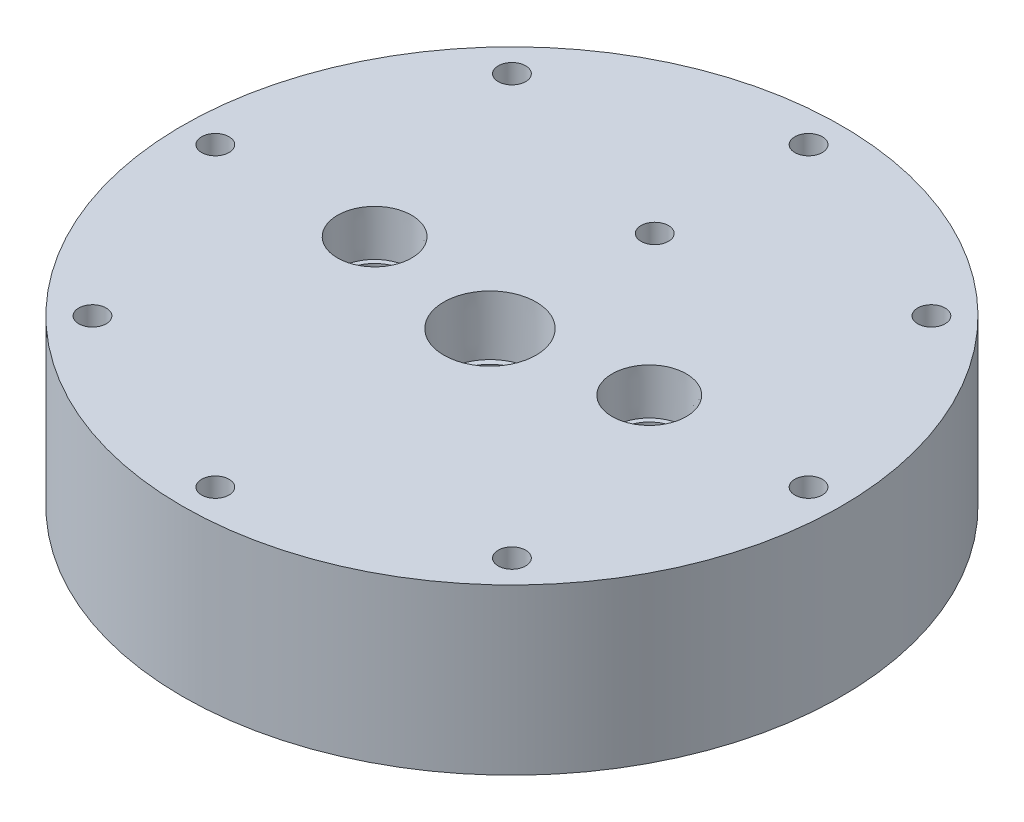
ISO-10303-21;
HEADER;
FILE_DESCRIPTION(('STEP AP214'),'2;1');
FILE_NAME('part.step','',(''),(''),'','','');
FILE_SCHEMA(('AUTOMOTIVE_DESIGN { 1 0 10303 214 1 1 1 1 }'));
ENDSEC;
DATA;
#1=APPLICATION_CONTEXT('core data for automotive mechanical design processes');
#2=APPLICATION_PROTOCOL_DEFINITION('international standard','automotive_design',2000,#1);
#3=PRODUCT_CONTEXT('',#1,'mechanical');
#4=PRODUCT('Part','Part','',(#3));
#5=PRODUCT_RELATED_PRODUCT_CATEGORY('part','',(#4));
#6=PRODUCT_DEFINITION_FORMATION('','',#4);
#7=PRODUCT_DEFINITION_CONTEXT('part definition',#1,'design');
#8=PRODUCT_DEFINITION('design','',#6,#7);
#9=PRODUCT_DEFINITION_SHAPE('','',#8);
#10=(LENGTH_UNIT() NAMED_UNIT(*) SI_UNIT(.MILLI.,.METRE.));
#11=(NAMED_UNIT(*) PLANE_ANGLE_UNIT() SI_UNIT($,.RADIAN.));
#12=(NAMED_UNIT(*) SI_UNIT($,.STERADIAN.) SOLID_ANGLE_UNIT());
#13=UNCERTAINTY_MEASURE_WITH_UNIT(LENGTH_MEASURE(1.E-05),#10,'distance_accuracy_value','');
#14=(GEOMETRIC_REPRESENTATION_CONTEXT(3) GLOBAL_UNCERTAINTY_ASSIGNED_CONTEXT((#13)) GLOBAL_UNIT_ASSIGNED_CONTEXT((#10,
#11,#12)) REPRESENTATION_CONTEXT('',''));
#15=CARTESIAN_POINT('',(0.,0.,0.));
#16=DIRECTION('',(0.,0.,1.));
#17=DIRECTION('',(1.,0.,0.));
#18=AXIS2_PLACEMENT_3D('',#15,#16,#17);
#19=CARTESIAN_POINT('',(0.,-36.83,0.));
#20=DIRECTION('',(0.,1.,0.));
#21=DIRECTION('',(0.,0.,1.));
#22=AXIS2_PLACEMENT_3D('',#19,#20,#21);
#23=PLANE('',#22);
#24=CARTESIAN_POINT('',(0.,-36.83,0.));
#25=DIRECTION('',(0.,1.,0.));
#26=DIRECTION('',(0.,0.,1.));
#27=AXIS2_PLACEMENT_3D('',#24,#25,#26);
#28=CIRCLE('',#27,13.97);
#29=CARTESIAN_POINT('',(-1.36470758739021,-36.83,13.903182125));
#30=VERTEX_POINT('',#29);
#31=CARTESIAN_POINT('',(1.36470758739021,-36.83,13.903182125));
#32=VERTEX_POINT('',#31);
#33=EDGE_CURVE('E71',#30,#32,#28,.F.);
#34=ORIENTED_EDGE('',*,*,#33,.F.);
#35=CARTESIAN_POINT('',(0.,-36.83,5.08));
#36=DIRECTION('',(0.,1.,0.));
#37=DIRECTION('',(0.,0.,1.));
#38=AXIS2_PLACEMENT_3D('',#35,#36,#37);
#39=CIRCLE('',#38,8.9281);
#40=EDGE_CURVE('E56',#30,#32,#39,.T.);
#41=ORIENTED_EDGE('',*,*,#40,.T.);
#42=EDGE_LOOP('',(#34,#41));
#43=FACE_BOUND('',#42,.T.);
#44=CARTESIAN_POINT('',(0.,-36.83,0.));
#45=DIRECTION('',(0.,-1.,0.));
#46=DIRECTION('',(0.,0.,-1.));
#47=AXIS2_PLACEMENT_3D('',#44,#45,#46);
#48=CIRCLE('',#47,16.51);
#49=CARTESIAN_POINT('',(0.,-36.83,-16.51));
#50=VERTEX_POINT('',#49);
#51=EDGE_CURVE('E217',#50,#50,#48,.T.);
#52=ORIENTED_EDGE('',*,*,#51,.T.);
#53=EDGE_LOOP('',(#52));
#54=FACE_BOUND('',#53,.T.);
#55=ADVANCED_FACE('F35',(#43,#54),#23,.F.);
#56=CARTESIAN_POINT('',(0.,-40.64,0.));
#57=DIRECTION('',(0.,1.,0.));
#58=DIRECTION('',(0.,0.,1.));
#59=AXIS2_PLACEMENT_3D('',#56,#57,#58);
#60=PLANE('',#59);
#61=CARTESIAN_POINT('',(0.,-40.64,-33.02));
#62=DIRECTION('',(0.,1.,0.));
#63=DIRECTION('',(0.,0.,1.));
#64=AXIS2_PLACEMENT_3D('',#61,#62,#63);
#65=CIRCLE('',#64,3.175);
#66=CARTESIAN_POINT('',(0.,-40.64,-29.845));
#67=VERTEX_POINT('',#66);
#68=EDGE_CURVE('E235',#67,#67,#65,.F.);
#69=ORIENTED_EDGE('',*,*,#68,.F.);
#70=EDGE_LOOP('',(#69));
#71=FACE_BOUND('',#70,.T.);
#72=CARTESIAN_POINT('',(0.,-40.64,-33.02));
#73=DIRECTION('',(0.,1.,0.));
#74=DIRECTION('',(0.,0.,1.));
#75=AXIS2_PLACEMENT_3D('',#72,#73,#74);
#76=CIRCLE('',#75,7.62);
#77=CARTESIAN_POINT('',(0.,-40.64,-25.4));
#78=VERTEX_POINT('',#77);
#79=EDGE_CURVE('E214',#78,#78,#76,.T.);
#80=ORIENTED_EDGE('',*,*,#79,.F.);
#81=EDGE_LOOP('',(#80));
#82=FACE_BOUND('',#81,.T.);
#83=ADVANCED_FACE('F184',(#71,#82),#60,.F.);
#84=CARTESIAN_POINT('',(0.,-36.83,0.));
#85=DIRECTION('',(0.,-1.,0.));
#86=DIRECTION('',(0.,0.,-1.));
#87=AXIS2_PLACEMENT_3D('',#84,#85,#86);
#88=CYLINDRICAL_SURFACE('',#87,19.05);
#89=CARTESIAN_POINT('',(0.,-40.64,0.));
#90=DIRECTION('',(0.,1.,0.));
#91=DIRECTION('',(0.,0.,1.));
#92=AXIS2_PLACEMENT_3D('',#89,#90,#91);
#93=CIRCLE('',#92,19.05);
#94=CARTESIAN_POINT('',(0.,-40.64,19.05));
#95=VERTEX_POINT('',#94);
#96=EDGE_CURVE('E84',#95,#95,#93,.T.);
#97=ORIENTED_EDGE('',*,*,#96,.F.);
#98=EDGE_LOOP('',(#97));
#99=FACE_BOUND('',#98,.T.);
#100=CARTESIAN_POINT('',(0.,-36.83,0.));
#101=DIRECTION('',(0.,1.,0.));
#102=DIRECTION('',(0.,0.,1.));
#103=AXIS2_PLACEMENT_3D('',#100,#101,#102);
#104=CIRCLE('',#103,19.05);
#105=CARTESIAN_POINT('',(0.,-36.83,19.05));
#106=VERTEX_POINT('',#105);
#107=EDGE_CURVE('E75',#106,#106,#104,.T.);
#108=ORIENTED_EDGE('',*,*,#107,.T.);
#109=EDGE_LOOP('',(#108));
#110=FACE_BOUND('',#109,.T.);
#111=ADVANCED_FACE('F190',(#99,#110),#88,.F.);
#112=CARTESIAN_POINT('',(0.,-36.83,0.));
#113=DIRECTION('',(0.,-1.,0.));
#114=DIRECTION('',(0.,0.,-1.));
#115=AXIS2_PLACEMENT_3D('',#112,#113,#114);
#116=CIRCLE('',#115,17.78);
#117=CARTESIAN_POINT('',(0.,-36.83,-17.78));
#118=VERTEX_POINT('',#117);
#119=EDGE_CURVE('E206',#118,#118,#116,.T.);
#120=ORIENTED_EDGE('',*,*,#119,.F.);
#121=EDGE_LOOP('',(#120));
#122=FACE_BOUND('',#121,.T.);
#123=ORIENTED_EDGE('',*,*,#107,.F.);
#124=EDGE_LOOP('',(#123));
#125=FACE_BOUND('',#124,.T.);
#126=ADVANCED_FACE('F186',(#122,#125),#23,.F.);
#127=CARTESIAN_POINT('',(0.,-30.48,0.));
#128=DIRECTION('',(0.,-1.,0.));
#129=DIRECTION('',(0.,0.,-1.));
#130=AXIS2_PLACEMENT_3D('',#127,#128,#129);
#131=CYLINDRICAL_SURFACE('',#130,13.97);
#132=DIRECTION('',(0.,1.,0.));
#133=VECTOR('',#132,1.);
#134=CARTESIAN_POINT('',(-1.36470758739021,-38.481,13.903182125));
#135=LINE('',#134,#133);
#136=CARTESIAN_POINT('',(-1.36470758739021,-30.48,13.903182125));
#137=VERTEX_POINT('',#136);
#138=EDGE_CURVE('E11',#30,#137,#135,.T.);
#139=ORIENTED_EDGE('',*,*,#138,.F.);
#140=ORIENTED_EDGE('',*,*,#33,.T.);
#141=DIRECTION('',(0.,1.,0.));
#142=VECTOR('',#141,1.);
#143=CARTESIAN_POINT('',(1.36470758739021,-38.481,13.903182125));
#144=LINE('',#143,#142);
#145=CARTESIAN_POINT('',(1.36470758739021,-30.48,13.903182125));
#146=VERTEX_POINT('',#145);
#147=EDGE_CURVE('E44',#146,#32,#144,.F.);
#148=ORIENTED_EDGE('',*,*,#147,.F.);
#149=CARTESIAN_POINT('',(0.,-30.48,0.));
#150=DIRECTION('',(0.,1.,0.));
#151=DIRECTION('',(0.,0.,1.));
#152=AXIS2_PLACEMENT_3D('',#149,#150,#151);
#153=CIRCLE('',#152,13.97);
#154=EDGE_CURVE('E76',#146,#137,#153,.T.);
#155=ORIENTED_EDGE('',*,*,#154,.T.);
#156=EDGE_LOOP('',(#139,#140,#148,#155));
#157=FACE_BOUND('',#156,.T.);
#158=ADVANCED_FACE('F74',(#157),#131,.F.);
#159=CARTESIAN_POINT('',(0.,-30.48,0.));
#160=DIRECTION('',(0.,1.,0.));
#161=DIRECTION('',(0.,0.,1.));
#162=AXIS2_PLACEMENT_3D('',#159,#160,#161);
#163=PLANE('',#162);
#164=ORIENTED_EDGE('',*,*,#154,.F.);
#165=CARTESIAN_POINT('',(0.,-30.48,5.08));
#166=DIRECTION('',(0.,1.,0.));
#167=DIRECTION('',(0.,0.,1.));
#168=AXIS2_PLACEMENT_3D('',#165,#166,#167);
#169=CIRCLE('',#168,8.9281);
#170=EDGE_CURVE('E51',#146,#137,#169,.T.);
#171=ORIENTED_EDGE('',*,*,#170,.T.);
#172=EDGE_LOOP('',(#164,#171));
#173=FACE_BOUND('',#172,.T.);
#174=ADVANCED_FACE('F201',(#173),#163,.F.);
#175=CARTESIAN_POINT('',(0.,-40.64,0.));
#176=DIRECTION('',(0.,-1.,0.));
#177=DIRECTION('',(0.,0.,-1.));
#178=AXIS2_PLACEMENT_3D('',#175,#176,#177);
#179=CYLINDRICAL_SURFACE('',#178,60.96);
#180=CARTESIAN_POINT('',(0.,-40.64,0.));
#181=DIRECTION('',(0.,1.,0.));
#182=DIRECTION('',(0.,0.,1.));
#183=AXIS2_PLACEMENT_3D('',#180,#181,#182);
#184=CIRCLE('',#183,60.96);
#185=CARTESIAN_POINT('',(0.,-40.64,60.96));
#186=VERTEX_POINT('',#185);
#187=EDGE_CURVE('E87',#186,#186,#184,.T.);
#188=ORIENTED_EDGE('',*,*,#187,.T.);
#189=EDGE_LOOP('',(#188));
#190=FACE_BOUND('',#189,.T.);
#191=CARTESIAN_POINT('',(0.,-50.8,0.));
#192=DIRECTION('',(0.,1.,0.));
#193=DIRECTION('',(0.,0.,1.));
#194=AXIS2_PLACEMENT_3D('',#191,#192,#193);
#195=CIRCLE('',#194,60.96);
#196=CARTESIAN_POINT('',(0.,-50.8,60.96));
#197=VERTEX_POINT('',#196);
#198=EDGE_CURVE('E72',#197,#197,#195,.T.);
#199=ORIENTED_EDGE('',*,*,#198,.F.);
#200=EDGE_LOOP('',(#199));
#201=FACE_BOUND('',#200,.T.);
#202=ADVANCED_FACE('F290',(#190,#201),#179,.F.);
#203=CARTESIAN_POINT('',(0.,-40.64,-33.02));
#204=DIRECTION('',(0.,1.,0.));
#205=DIRECTION('',(0.,0.,1.));
#206=AXIS2_PLACEMENT_3D('',#203,#204,#205);
#207=CIRCLE('',#206,8.89);
#208=CARTESIAN_POINT('',(0.,-40.64,-24.13));
#209=VERTEX_POINT('',#208);
#210=EDGE_CURVE('E224',#209,#209,#207,.T.);
#211=ORIENTED_EDGE('',*,*,#210,.T.);
#212=EDGE_LOOP('',(#211));
#213=FACE_BOUND('',#212,.T.);
#214=CARTESIAN_POINT('',(-31.75,-40.64,0.));
#215=DIRECTION('',(0.,1.,0.));
#216=DIRECTION('',(0.,0.,1.));
#217=AXIS2_PLACEMENT_3D('',#214,#215,#216);
#218=CIRCLE('',#217,7.1374);
#219=CARTESIAN_POINT('',(-31.75,-40.64,7.1374));
#220=VERTEX_POINT('',#219);
#221=EDGE_CURVE('E39',#220,#220,#218,.T.);
#222=ORIENTED_EDGE('',*,*,#221,.T.);
#223=EDGE_LOOP('',(#222));
#224=FACE_BOUND('',#223,.T.);
#225=CARTESIAN_POINT('',(31.75,-40.64,0.));
#226=DIRECTION('',(0.,1.,0.));
#227=DIRECTION('',(0.,0.,1.));
#228=AXIS2_PLACEMENT_3D('',#225,#226,#227);
#229=CIRCLE('',#228,7.1374);
#230=CARTESIAN_POINT('',(31.75,-40.64,7.1374));
#231=VERTEX_POINT('',#230);
#232=EDGE_CURVE('E88',#231,#231,#229,.T.);
#233=ORIENTED_EDGE('',*,*,#232,.T.);
#234=EDGE_LOOP('',(#233));
#235=FACE_BOUND('',#234,.T.);
#236=ORIENTED_EDGE('',*,*,#96,.T.);
#237=EDGE_LOOP('',(#236));
#238=FACE_BOUND('',#237,.T.);
#239=ORIENTED_EDGE('',*,*,#187,.F.);
#240=EDGE_LOOP('',(#239));
#241=FACE_BOUND('',#240,.T.);
#242=ADVANCED_FACE('F179',(#213,#224,#235,#238,#241),#60,.F.);
#243=CARTESIAN_POINT('',(0.,-12.7,0.));
#244=DIRECTION('',(0.,1.,0.));
#245=DIRECTION('',(0.,0.,1.));
#246=AXIS2_PLACEMENT_3D('',#243,#244,#245);
#247=PLANE('',#246);
#248=CARTESIAN_POINT('',(0.,-12.7,-33.02));
#249=DIRECTION('',(0.,1.,0.));
#250=DIRECTION('',(0.,0.,1.));
#251=AXIS2_PLACEMENT_3D('',#248,#249,#250);
#252=CIRCLE('',#251,3.175);
#253=CARTESIAN_POINT('',(0.,-12.7,-29.845));
#254=VERTEX_POINT('',#253);
#255=EDGE_CURVE('E230',#254,#254,#252,.F.);
#256=ORIENTED_EDGE('',*,*,#255,.T.);
#257=EDGE_LOOP('',(#256));
#258=FACE_BOUND('',#257,.T.);
#259=CARTESIAN_POINT('',(-31.75,-12.7,0.));
#260=DIRECTION('',(0.,1.,0.));
#261=DIRECTION('',(0.,0.,1.));
#262=AXIS2_PLACEMENT_3D('',#259,#260,#261);
#263=CIRCLE('',#262,8.5750146);
#264=CARTESIAN_POINT('',(-31.75,-12.7,8.5750146));
#265=VERTEX_POINT('',#264);
#266=EDGE_CURVE('E238',#265,#265,#263,.T.);
#267=ORIENTED_EDGE('',*,*,#266,.F.);
#268=EDGE_LOOP('',(#267));
#269=FACE_BOUND('',#268,.T.);
#270=CARTESIAN_POINT('',(31.75,-12.7,0.));
#271=DIRECTION('',(0.,1.,0.));
#272=DIRECTION('',(0.,0.,1.));
#273=AXIS2_PLACEMENT_3D('',#270,#271,#272);
#274=CIRCLE('',#273,8.5750146);
#275=CARTESIAN_POINT('',(31.75,-12.7,8.5750146));
#276=VERTEX_POINT('',#275);
#277=EDGE_CURVE('E103',#276,#276,#274,.T.);
#278=ORIENTED_EDGE('',*,*,#277,.F.);
#279=EDGE_LOOP('',(#278));
#280=FACE_BOUND('',#279,.T.);
#281=CARTESIAN_POINT('',(0.,-12.7,5.08));
#282=DIRECTION('',(0.,1.,0.));
#283=DIRECTION('',(0.,0.,1.));
#284=AXIS2_PLACEMENT_3D('',#281,#282,#283);
#285=CIRCLE('',#284,10.6647361);
#286=CARTESIAN_POINT('',(0.,-12.7,15.7447361));
#287=VERTEX_POINT('',#286);
#288=EDGE_CURVE('E90',#287,#287,#285,.T.);
#289=ORIENTED_EDGE('',*,*,#288,.F.);
#290=EDGE_LOOP('',(#289));
#291=FACE_BOUND('',#290,.T.);
#292=CARTESIAN_POINT('',(68.58,-12.7,2.41126874597481E-13));
#293=DIRECTION('',(0.,1.,0.));
#294=DIRECTION('',(0.,0.,1.));
#295=AXIS2_PLACEMENT_3D('',#292,#293,#294);
#296=CIRCLE('',#295,3.175);
#297=CARTESIAN_POINT('',(68.58,-12.7,3.17500000000024));
#298=VERTEX_POINT('',#297);
#299=EDGE_CURVE('E132',#298,#298,#296,.T.);
#300=ORIENTED_EDGE('',*,*,#299,.F.);
#301=EDGE_LOOP('',(#300));
#302=FACE_BOUND('',#301,.T.);
#303=CARTESIAN_POINT('',(48.4933830537732,-12.7,48.4933830537737));
#304=DIRECTION('',(0.,1.,0.));
#305=DIRECTION('',(0.,0.,1.));
#306=AXIS2_PLACEMENT_3D('',#303,#304,#305);
#307=CIRCLE('',#306,3.175);
#308=CARTESIAN_POINT('',(48.4933830537732,-12.7,51.6683830537737));
#309=VERTEX_POINT('',#308);
#310=EDGE_CURVE('E133',#309,#309,#307,.T.);
#311=ORIENTED_EDGE('',*,*,#310,.F.);
#312=EDGE_LOOP('',(#311));
#313=FACE_BOUND('',#312,.T.);
#314=CARTESIAN_POINT('',(0.,-12.7,68.58));
#315=DIRECTION('',(0.,1.,0.));
#316=DIRECTION('',(0.,0.,1.));
#317=AXIS2_PLACEMENT_3D('',#314,#315,#316);
#318=CIRCLE('',#317,3.175);
#319=CARTESIAN_POINT('',(0.,-12.7,71.755));
#320=VERTEX_POINT('',#319);
#321=EDGE_CURVE('E140',#320,#320,#318,.T.);
#322=ORIENTED_EDGE('',*,*,#321,.F.);
#323=EDGE_LOOP('',(#322));
#324=FACE_BOUND('',#323,.T.);
#325=CARTESIAN_POINT('',(-48.4933830537739,-12.7,48.493383053773));
#326=DIRECTION('',(0.,1.,0.));
#327=DIRECTION('',(0.,0.,1.));
#328=AXIS2_PLACEMENT_3D('',#325,#326,#327);
#329=CIRCLE('',#328,3.175);
#330=CARTESIAN_POINT('',(-48.4933830537739,-12.7,51.668383053773));
#331=VERTEX_POINT('',#330);
#332=EDGE_CURVE('E146',#331,#331,#329,.T.);
#333=ORIENTED_EDGE('',*,*,#332,.F.);
#334=EDGE_LOOP('',(#333));
#335=FACE_BOUND('',#334,.T.);
#336=CARTESIAN_POINT('',(-68.58,-12.7,-7.20018455033205E-13));
#337=DIRECTION('',(0.,1.,0.));
#338=DIRECTION('',(0.,0.,1.));
#339=AXIS2_PLACEMENT_3D('',#336,#337,#338);
#340=CIRCLE('',#339,3.175);
#341=CARTESIAN_POINT('',(-68.58,-12.7,3.17499999999928));
#342=VERTEX_POINT('',#341);
#343=EDGE_CURVE('E120',#342,#342,#340,.T.);
#344=ORIENTED_EDGE('',*,*,#343,.F.);
#345=EDGE_LOOP('',(#344));
#346=FACE_BOUND('',#345,.T.);
#347=CARTESIAN_POINT('',(-48.4933830537728,-12.7,-48.493383053774));
#348=DIRECTION('',(0.,1.,0.));
#349=DIRECTION('',(0.,0.,1.));
#350=AXIS2_PLACEMENT_3D('',#347,#348,#349);
#351=CIRCLE('',#350,3.175);
#352=CARTESIAN_POINT('',(-48.4933830537728,-12.7,-45.318383053774));
#353=VERTEX_POINT('',#352);
#354=EDGE_CURVE('E121',#353,#353,#351,.T.);
#355=ORIENTED_EDGE('',*,*,#354,.F.);
#356=EDGE_LOOP('',(#355));
#357=FACE_BOUND('',#356,.T.);
#358=CARTESIAN_POINT('',(48.4933830537735,-12.7,-48.4933830537733));
#359=DIRECTION('',(0.,1.,0.));
#360=DIRECTION('',(0.,0.,1.));
#361=AXIS2_PLACEMENT_3D('',#358,#359,#360);
#362=CIRCLE('',#361,3.175);
#363=CARTESIAN_POINT('',(48.4933830537735,-12.7,-45.3183830537734));
#364=VERTEX_POINT('',#363);
#365=EDGE_CURVE('E155',#364,#364,#362,.T.);
#366=ORIENTED_EDGE('',*,*,#365,.F.);
#367=EDGE_LOOP('',(#366));
#368=FACE_BOUND('',#367,.T.);
#369=CARTESIAN_POINT('',(0.,-12.7,-68.58));
#370=DIRECTION('',(0.,1.,0.));
#371=DIRECTION('',(0.,0.,1.));
#372=AXIS2_PLACEMENT_3D('',#369,#370,#371);
#373=CIRCLE('',#372,3.175);
#374=CARTESIAN_POINT('',(0.,-12.7,-65.405));
#375=VERTEX_POINT('',#374);
#376=EDGE_CURVE('E161',#375,#375,#373,.T.);
#377=ORIENTED_EDGE('',*,*,#376,.F.);
#378=EDGE_LOOP('',(#377));
#379=FACE_BOUND('',#378,.T.);
#380=CARTESIAN_POINT('',(0.,-12.7,0.));
#381=DIRECTION('',(0.,1.,0.));
#382=DIRECTION('',(0.,0.,1.));
#383=AXIS2_PLACEMENT_3D('',#380,#381,#382);
#384=CIRCLE('',#383,76.2);
#385=CARTESIAN_POINT('',(0.,-12.7,76.2));
#386=VERTEX_POINT('',#385);
#387=EDGE_CURVE('E80',#386,#386,#384,.T.);
#388=ORIENTED_EDGE('',*,*,#387,.T.);
#389=EDGE_LOOP('',(#388));
#390=FACE_BOUND('',#389,.T.);
#391=ADVANCED_FACE('F167',(#258,#269,#280,#291,#302,#313,#324,#335,#346,#357,#368,#379,#390),
#247,.T.);
#392=CARTESIAN_POINT('',(0.,-50.8,0.));
#393=DIRECTION('',(0.,1.,0.));
#394=DIRECTION('',(0.,0.,1.));
#395=AXIS2_PLACEMENT_3D('',#392,#393,#394);
#396=CYLINDRICAL_SURFACE('',#395,76.2);
#397=CARTESIAN_POINT('',(0.,-50.8,0.));
#398=DIRECTION('',(0.,1.,0.));
#399=DIRECTION('',(0.,0.,1.));
#400=AXIS2_PLACEMENT_3D('',#397,#398,#399);
#401=CIRCLE('',#400,76.2);
#402=CARTESIAN_POINT('',(0.,-50.8,76.2));
#403=VERTEX_POINT('',#402);
#404=EDGE_CURVE('E66',#403,#403,#401,.T.);
#405=ORIENTED_EDGE('',*,*,#404,.T.);
#406=EDGE_LOOP('',(#405));
#407=FACE_BOUND('',#406,.T.);
#408=ORIENTED_EDGE('',*,*,#387,.F.);
#409=EDGE_LOOP('',(#408));
#410=FACE_BOUND('',#409,.T.);
#411=ADVANCED_FACE('F37',(#407,#410),#396,.T.);
#412=CARTESIAN_POINT('',(0.,-12.699,-68.58));
#413=DIRECTION('',(0.,-1.,0.));
#414=DIRECTION('',(0.,0.,-1.));
#415=AXIS2_PLACEMENT_3D('',#412,#413,#414);
#416=CYLINDRICAL_SURFACE('',#415,3.175);
#417=ORIENTED_EDGE('',*,*,#376,.T.);
#418=EDGE_LOOP('',(#417));
#419=FACE_BOUND('',#418,.T.);
#420=CARTESIAN_POINT('',(0.,-50.8,-68.58));
#421=DIRECTION('',(0.,1.,0.));
#422=DIRECTION('',(0.,0.,1.));
#423=AXIS2_PLACEMENT_3D('',#420,#421,#422);
#424=CIRCLE('',#423,3.175);
#425=CARTESIAN_POINT('',(0.,-50.8,-65.405));
#426=VERTEX_POINT('',#425);
#427=EDGE_CURVE('E158',#426,#426,#424,.T.);
#428=ORIENTED_EDGE('',*,*,#427,.F.);
#429=EDGE_LOOP('',(#428));
#430=FACE_BOUND('',#429,.T.);
#431=ADVANCED_FACE('F170',(#419,#430),#416,.F.);
#432=CARTESIAN_POINT('',(48.4933830537735,-12.699,-48.4933830537733));
#433=DIRECTION('',(0.,-1.,0.));
#434=DIRECTION('',(0.,0.,-1.));
#435=AXIS2_PLACEMENT_3D('',#432,#433,#434);
#436=CYLINDRICAL_SURFACE('',#435,3.175);
#437=ORIENTED_EDGE('',*,*,#365,.T.);
#438=EDGE_LOOP('',(#437));
#439=FACE_BOUND('',#438,.T.);
#440=CARTESIAN_POINT('',(48.4933830537735,-50.8,-48.4933830537733));
#441=DIRECTION('',(0.,1.,0.));
#442=DIRECTION('',(-0.707106781186549,0.,0.707106781186546));
#443=AXIS2_PLACEMENT_3D('',#440,#441,#442);
#444=CIRCLE('',#443,3.175);
#445=CARTESIAN_POINT('',(46.2483190235062,-50.8,-46.2483190235061));
#446=VERTEX_POINT('',#445);
#447=EDGE_CURVE('E136',#446,#446,#444,.T.);
#448=ORIENTED_EDGE('',*,*,#447,.F.);
#449=EDGE_LOOP('',(#448));
#450=FACE_BOUND('',#449,.T.);
#451=ADVANCED_FACE('F176',(#439,#450),#436,.F.);
#452=CARTESIAN_POINT('',(-48.4933830537728,-12.699,-48.493383053774));
#453=DIRECTION('',(0.,-1.,0.));
#454=DIRECTION('',(0.,0.,-1.));
#455=AXIS2_PLACEMENT_3D('',#452,#453,#454);
#456=CYLINDRICAL_SURFACE('',#455,3.175);
#457=ORIENTED_EDGE('',*,*,#354,.T.);
#458=EDGE_LOOP('',(#457));
#459=FACE_BOUND('',#458,.T.);
#460=CARTESIAN_POINT('',(-48.4933830537728,-50.8,-48.493383053774));
#461=DIRECTION('',(0.,1.,0.));
#462=DIRECTION('',(0.707106781186539,0.,0.707106781186556));
#463=AXIS2_PLACEMENT_3D('',#460,#461,#462);
#464=CIRCLE('',#463,3.175);
#465=CARTESIAN_POINT('',(-46.2483190235056,-50.8,-46.2483190235067));
#466=VERTEX_POINT('',#465);
#467=EDGE_CURVE('E86',#466,#466,#464,.T.);
#468=ORIENTED_EDGE('',*,*,#467,.F.);
#469=EDGE_LOOP('',(#468));
#470=FACE_BOUND('',#469,.T.);
#471=ADVANCED_FACE('F299',(#459,#470),#456,.F.);
#472=CARTESIAN_POINT('',(-68.58,-12.699,-7.20018455033205E-13));
#473=DIRECTION('',(0.,-1.,0.));
#474=DIRECTION('',(0.,0.,-1.));
#475=AXIS2_PLACEMENT_3D('',#472,#473,#474);
#476=CYLINDRICAL_SURFACE('',#475,3.175);
#477=ORIENTED_EDGE('',*,*,#343,.T.);
#478=EDGE_LOOP('',(#477));
#479=FACE_BOUND('',#478,.T.);
#480=CARTESIAN_POINT('',(-68.58,-50.8,-7.20018455033205E-13));
#481=DIRECTION('',(0.,1.,0.));
#482=DIRECTION('',(1.,0.,0.));
#483=AXIS2_PLACEMENT_3D('',#480,#481,#482);
#484=CIRCLE('',#483,3.175);
#485=CARTESIAN_POINT('',(-65.405,-50.8,-6.86762095280724E-13));
#486=VERTEX_POINT('',#485);
#487=EDGE_CURVE('E117',#486,#486,#484,.T.);
#488=ORIENTED_EDGE('',*,*,#487,.F.);
#489=EDGE_LOOP('',(#488));
#490=FACE_BOUND('',#489,.T.);
#491=ADVANCED_FACE('F295',(#479,#490),#476,.F.);
#492=CARTESIAN_POINT('',(-48.4933830537739,-12.699,48.493383053773));
#493=DIRECTION('',(0.,-1.,0.));
#494=DIRECTION('',(0.,0.,-1.));
#495=AXIS2_PLACEMENT_3D('',#492,#493,#494);
#496=CYLINDRICAL_SURFACE('',#495,3.175);
#497=ORIENTED_EDGE('',*,*,#332,.T.);
#498=EDGE_LOOP('',(#497));
#499=FACE_BOUND('',#498,.T.);
#500=CARTESIAN_POINT('',(-48.4933830537739,-50.8,48.493383053773));
#501=DIRECTION('',(0.,1.,0.));
#502=DIRECTION('',(0.707106781186554,0.,-0.707106781186541));
#503=AXIS2_PLACEMENT_3D('',#500,#501,#502);
#504=CIRCLE('',#503,3.175);
#505=CARTESIAN_POINT('',(-46.2483190235065,-50.8,46.2483190235057));
#506=VERTEX_POINT('',#505);
#507=EDGE_CURVE('E124',#506,#506,#504,.T.);
#508=ORIENTED_EDGE('',*,*,#507,.F.);
#509=EDGE_LOOP('',(#508));
#510=FACE_BOUND('',#509,.T.);
#511=ADVANCED_FACE('F298',(#499,#510),#496,.F.);
#512=CARTESIAN_POINT('',(0.,-12.699,68.58));
#513=DIRECTION('',(0.,-1.,0.));
#514=DIRECTION('',(0.,0.,-1.));
#515=AXIS2_PLACEMENT_3D('',#512,#513,#514);
#516=CYLINDRICAL_SURFACE('',#515,3.175);
#517=ORIENTED_EDGE('',*,*,#321,.T.);
#518=EDGE_LOOP('',(#517));
#519=FACE_BOUND('',#518,.T.);
#520=CARTESIAN_POINT('',(0.,-50.8,68.58));
#521=DIRECTION('',(0.,1.,0.));
#522=DIRECTION('',(0.,0.,-1.));
#523=AXIS2_PLACEMENT_3D('',#520,#521,#522);
#524=CIRCLE('',#523,3.175);
#525=CARTESIAN_POINT('',(0.,-50.8,65.405));
#526=VERTEX_POINT('',#525);
#527=EDGE_CURVE('E143',#526,#526,#524,.T.);
#528=ORIENTED_EDGE('',*,*,#527,.F.);
#529=EDGE_LOOP('',(#528));
#530=FACE_BOUND('',#529,.T.);
#531=ADVANCED_FACE('F311',(#519,#530),#516,.F.);
#532=CARTESIAN_POINT('',(48.4933830537732,-12.699,48.4933830537737));
#533=DIRECTION('',(0.,-1.,0.));
#534=DIRECTION('',(0.,0.,-1.));
#535=AXIS2_PLACEMENT_3D('',#532,#533,#534);
#536=CYLINDRICAL_SURFACE('',#535,3.175);
#537=ORIENTED_EDGE('',*,*,#310,.T.);
#538=EDGE_LOOP('',(#537));
#539=FACE_BOUND('',#538,.T.);
#540=CARTESIAN_POINT('',(48.4933830537732,-50.8,48.4933830537737));
#541=DIRECTION('',(0.,1.,0.));
#542=DIRECTION('',(-0.707106781186544,0.,-0.707106781186551));
#543=AXIS2_PLACEMENT_3D('',#540,#541,#542);
#544=CIRCLE('',#543,3.175);
#545=CARTESIAN_POINT('',(46.2483190235059,-50.8,46.2483190235064));
#546=VERTEX_POINT('',#545);
#547=EDGE_CURVE('E137',#546,#546,#544,.T.);
#548=ORIENTED_EDGE('',*,*,#547,.F.);
#549=EDGE_LOOP('',(#548));
#550=FACE_BOUND('',#549,.T.);
#551=ADVANCED_FACE('F307',(#539,#550),#536,.F.);
#552=CARTESIAN_POINT('',(68.58,-12.699,2.41126874597481E-13));
#553=DIRECTION('',(0.,-1.,0.));
#554=DIRECTION('',(0.,0.,-1.));
#555=AXIS2_PLACEMENT_3D('',#552,#553,#554);
#556=CYLINDRICAL_SURFACE('',#555,3.175);
#557=ORIENTED_EDGE('',*,*,#299,.T.);
#558=EDGE_LOOP('',(#557));
#559=FACE_BOUND('',#558,.T.);
#560=CARTESIAN_POINT('',(68.58,-50.8,2.41126874597481E-13));
#561=DIRECTION('',(0.,1.,0.));
#562=DIRECTION('',(-1.,0.,0.));
#563=AXIS2_PLACEMENT_3D('',#560,#561,#562);
#564=CIRCLE('',#563,3.175);
#565=CARTESIAN_POINT('',(65.405,-50.8,2.30041421346654E-13));
#566=VERTEX_POINT('',#565);
#567=EDGE_CURVE('E129',#566,#566,#564,.T.);
#568=ORIENTED_EDGE('',*,*,#567,.F.);
#569=EDGE_LOOP('',(#568));
#570=FACE_BOUND('',#569,.T.);
#571=ADVANCED_FACE('F304',(#559,#570),#556,.F.);
#572=CARTESIAN_POINT('',(0.,-50.8,0.));
#573=DIRECTION('',(0.,1.,0.));
#574=DIRECTION('',(0.,0.,1.));
#575=AXIS2_PLACEMENT_3D('',#572,#573,#574);
#576=PLANE('',#575);
#577=ORIENTED_EDGE('',*,*,#198,.T.);
#578=EDGE_LOOP('',(#577));
#579=FACE_BOUND('',#578,.T.);
#580=ORIENTED_EDGE('',*,*,#567,.T.);
#581=EDGE_LOOP('',(#580));
#582=FACE_BOUND('',#581,.T.);
#583=ORIENTED_EDGE('',*,*,#547,.T.);
#584=EDGE_LOOP('',(#583));
#585=FACE_BOUND('',#584,.T.);
#586=ORIENTED_EDGE('',*,*,#527,.T.);
#587=EDGE_LOOP('',(#586));
#588=FACE_BOUND('',#587,.T.);
#589=ORIENTED_EDGE('',*,*,#507,.T.);
#590=EDGE_LOOP('',(#589));
#591=FACE_BOUND('',#590,.T.);
#592=ORIENTED_EDGE('',*,*,#487,.T.);
#593=EDGE_LOOP('',(#592));
#594=FACE_BOUND('',#593,.T.);
#595=ORIENTED_EDGE('',*,*,#467,.T.);
#596=EDGE_LOOP('',(#595));
#597=FACE_BOUND('',#596,.T.);
#598=ORIENTED_EDGE('',*,*,#447,.T.);
#599=EDGE_LOOP('',(#598));
#600=FACE_BOUND('',#599,.T.);
#601=ORIENTED_EDGE('',*,*,#427,.T.);
#602=EDGE_LOOP('',(#601));
#603=FACE_BOUND('',#602,.T.);
#604=ORIENTED_EDGE('',*,*,#404,.F.);
#605=EDGE_LOOP('',(#604));
#606=FACE_BOUND('',#605,.T.);
#607=ADVANCED_FACE('F286',(#579,#582,#585,#588,#591,#594,#597,#600,#603,#606),#576,.F.);
#608=CARTESIAN_POINT('',(0.,-12.7,5.08));
#609=DIRECTION('',(0.,1.,0.));
#610=DIRECTION('',(0.,0.,1.));
#611=AXIS2_PLACEMENT_3D('',#608,#609,#610);
#612=CYLINDRICAL_SURFACE('',#611,8.9281);
#613=CARTESIAN_POINT('',(0.,-26.162,5.08));
#614=DIRECTION('',(0.,1.,0.));
#615=DIRECTION('',(0.,0.,1.));
#616=AXIS2_PLACEMENT_3D('',#613,#614,#615);
#617=CIRCLE('',#616,8.9281);
#618=CARTESIAN_POINT('',(0.,-26.162,14.0081));
#619=VERTEX_POINT('',#618);
#620=EDGE_CURVE('E109',#619,#619,#617,.T.);
#621=ORIENTED_EDGE('',*,*,#620,.T.);
#622=EDGE_LOOP('',(#621));
#623=FACE_BOUND('',#622,.T.);
#624=ORIENTED_EDGE('',*,*,#138,.T.);
#625=ORIENTED_EDGE('',*,*,#170,.F.);
#626=ORIENTED_EDGE('',*,*,#147,.T.);
#627=ORIENTED_EDGE('',*,*,#40,.F.);
#628=EDGE_LOOP('',(#624,#625,#626,#627));
#629=FACE_BOUND('',#628,.T.);
#630=ADVANCED_FACE('F61',(#623,#629),#612,.F.);
#631=CARTESIAN_POINT('',(8.9281,-26.162,5.08));
#632=DIRECTION('',(0.,-1.,0.));
#633=DIRECTION('',(0.,0.,-1.));
#634=AXIS2_PLACEMENT_3D('',#631,#632,#633);
#635=PLANE('',#634);
#636=ORIENTED_EDGE('',*,*,#620,.F.);
#637=EDGE_LOOP('',(#636));
#638=FACE_BOUND('',#637,.T.);
#639=CARTESIAN_POINT('',(0.,-26.162,5.08));
#640=DIRECTION('',(0.,1.,0.));
#641=DIRECTION('',(0.,0.,1.));
#642=AXIS2_PLACEMENT_3D('',#639,#640,#641);
#643=CIRCLE('',#642,10.2616657920863);
#644=CARTESIAN_POINT('',(0.,-26.162,15.3416657920863));
#645=VERTEX_POINT('',#644);
#646=EDGE_CURVE('E95',#645,#645,#643,.T.);
#647=ORIENTED_EDGE('',*,*,#646,.T.);
#648=EDGE_LOOP('',(#647));
#649=FACE_BOUND('',#648,.T.);
#650=ADVANCED_FACE('F280',(#638,#649),#635,.F.);
#651=CARTESIAN_POINT('',(0.,-12.7,5.08));
#652=DIRECTION('',(0.,1.,0.));
#653=DIRECTION('',(0.,0.,1.));
#654=AXIS2_PLACEMENT_3D('',#651,#652,#653);
#655=CONICAL_SURFACE('',#654,10.6647361,0.0299323966717032);
#656=ORIENTED_EDGE('',*,*,#646,.F.);
#657=EDGE_LOOP('',(#656));
#658=FACE_BOUND('',#657,.T.);
#659=ORIENTED_EDGE('',*,*,#288,.T.);
#660=EDGE_LOOP('',(#659));
#661=FACE_BOUND('',#660,.T.);
#662=ADVANCED_FACE('F277',(#658,#661),#655,.F.);
#663=CARTESIAN_POINT('',(31.75,-12.7,0.));
#664=DIRECTION('',(0.,1.,0.));
#665=DIRECTION('',(0.,0.,1.));
#666=AXIS2_PLACEMENT_3D('',#663,#664,#665);
#667=CYLINDRICAL_SURFACE('',#666,7.1374);
#668=CARTESIAN_POINT('',(31.75,-23.114,0.));
#669=DIRECTION('',(0.,1.,0.));
#670=DIRECTION('',(0.,0.,1.));
#671=AXIS2_PLACEMENT_3D('',#668,#669,#670);
#672=CIRCLE('',#671,7.1374);
#673=CARTESIAN_POINT('',(31.75,-23.114,7.1374));
#674=VERTEX_POINT('',#673);
#675=EDGE_CURVE('E91',#674,#674,#672,.T.);
#676=ORIENTED_EDGE('',*,*,#675,.T.);
#677=EDGE_LOOP('',(#676));
#678=FACE_BOUND('',#677,.T.);
#679=ORIENTED_EDGE('',*,*,#232,.F.);
#680=EDGE_LOOP('',(#679));
#681=FACE_BOUND('',#680,.T.);
#682=ADVANCED_FACE('F273',(#678,#681),#667,.F.);
#683=CARTESIAN_POINT('',(38.8874,-23.114,0.));
#684=DIRECTION('',(0.,-1.,0.));
#685=DIRECTION('',(0.,0.,-1.));
#686=AXIS2_PLACEMENT_3D('',#683,#684,#685);
#687=PLANE('',#686);
#688=ORIENTED_EDGE('',*,*,#675,.F.);
#689=EDGE_LOOP('',(#688));
#690=FACE_BOUND('',#689,.T.);
#691=CARTESIAN_POINT('',(31.75,-23.114,0.));
#692=DIRECTION('',(0.,1.,0.));
#693=DIRECTION('',(0.,0.,1.));
#694=AXIS2_PLACEMENT_3D('',#691,#692,#693);
#695=CIRCLE('',#694,8.26320549387809);
#696=CARTESIAN_POINT('',(31.75,-23.114,8.26320549387809));
#697=VERTEX_POINT('',#696);
#698=EDGE_CURVE('E98',#697,#697,#695,.T.);
#699=ORIENTED_EDGE('',*,*,#698,.T.);
#700=EDGE_LOOP('',(#699));
#701=FACE_BOUND('',#700,.T.);
#702=ADVANCED_FACE('F266',(#690,#701),#687,.F.);
#703=CARTESIAN_POINT('',(31.75,-12.7,0.));
#704=DIRECTION('',(0.,1.,0.));
#705=DIRECTION('',(0.,0.,1.));
#706=AXIS2_PLACEMENT_3D('',#703,#704,#705);
#707=CONICAL_SURFACE('',#706,8.5750146,0.0299323966717029);
#708=ORIENTED_EDGE('',*,*,#698,.F.);
#709=EDGE_LOOP('',(#708));
#710=FACE_BOUND('',#709,.T.);
#711=ORIENTED_EDGE('',*,*,#277,.T.);
#712=EDGE_LOOP('',(#711));
#713=FACE_BOUND('',#712,.T.);
#714=ADVANCED_FACE('F256',(#710,#713),#707,.F.);
#715=CARTESIAN_POINT('',(-31.75,-12.7,0.));
#716=DIRECTION('',(0.,1.,0.));
#717=DIRECTION('',(0.,0.,1.));
#718=AXIS2_PLACEMENT_3D('',#715,#716,#717);
#719=CYLINDRICAL_SURFACE('',#718,7.1374);
#720=CARTESIAN_POINT('',(-31.75,-23.114,0.));
#721=DIRECTION('',(0.,1.,0.));
#722=DIRECTION('',(0.,0.,1.));
#723=AXIS2_PLACEMENT_3D('',#720,#721,#722);
#724=CIRCLE('',#723,7.1374);
#725=CARTESIAN_POINT('',(-31.75,-23.114,7.1374));
#726=VERTEX_POINT('',#725);
#727=EDGE_CURVE('E244',#726,#726,#724,.T.);
#728=ORIENTED_EDGE('',*,*,#727,.T.);
#729=EDGE_LOOP('',(#728));
#730=FACE_BOUND('',#729,.T.);
#731=ORIENTED_EDGE('',*,*,#221,.F.);
#732=EDGE_LOOP('',(#731));
#733=FACE_BOUND('',#732,.T.);
#734=ADVANCED_FACE('F253',(#730,#733),#719,.F.);
#735=CARTESIAN_POINT('',(-24.6126,-23.114,0.));
#736=DIRECTION('',(0.,-1.,0.));
#737=DIRECTION('',(0.,0.,-1.));
#738=AXIS2_PLACEMENT_3D('',#735,#736,#737);
#739=PLANE('',#738);
#740=ORIENTED_EDGE('',*,*,#727,.F.);
#741=EDGE_LOOP('',(#740));
#742=FACE_BOUND('',#741,.T.);
#743=CARTESIAN_POINT('',(-31.75,-23.114,0.));
#744=DIRECTION('',(0.,1.,0.));
#745=DIRECTION('',(0.,0.,1.));
#746=AXIS2_PLACEMENT_3D('',#743,#744,#745);
#747=CIRCLE('',#746,8.26320549387809);
#748=CARTESIAN_POINT('',(-31.75,-23.114,8.26320549387809));
#749=VERTEX_POINT('',#748);
#750=EDGE_CURVE('E241',#749,#749,#747,.T.);
#751=ORIENTED_EDGE('',*,*,#750,.T.);
#752=EDGE_LOOP('',(#751));
#753=FACE_BOUND('',#752,.T.);
#754=ADVANCED_FACE('F255',(#742,#753),#739,.F.);
#755=CARTESIAN_POINT('',(-31.75,-12.7,0.));
#756=DIRECTION('',(0.,1.,0.));
#757=DIRECTION('',(0.,0.,1.));
#758=AXIS2_PLACEMENT_3D('',#755,#756,#757);
#759=CONICAL_SURFACE('',#758,8.5750146,0.0299323966717026);
#760=ORIENTED_EDGE('',*,*,#750,.F.);
#761=EDGE_LOOP('',(#760));
#762=FACE_BOUND('',#761,.T.);
#763=ORIENTED_EDGE('',*,*,#266,.T.);
#764=EDGE_LOOP('',(#763));
#765=FACE_BOUND('',#764,.T.);
#766=ADVANCED_FACE('F263',(#762,#765),#759,.F.);
#767=CARTESIAN_POINT('',(0.,-50.801,-33.02));
#768=DIRECTION('',(0.,1.,0.));
#769=DIRECTION('',(0.,0.,1.));
#770=AXIS2_PLACEMENT_3D('',#767,#768,#769);
#771=CYLINDRICAL_SURFACE('',#770,3.175);
#772=ORIENTED_EDGE('',*,*,#255,.F.);
#773=EDGE_LOOP('',(#772));
#774=FACE_BOUND('',#773,.T.);
#775=ORIENTED_EDGE('',*,*,#68,.T.);
#776=EDGE_LOOP('',(#775));
#777=FACE_BOUND('',#776,.T.);
#778=ADVANCED_FACE('F357',(#774,#777),#771,.F.);
#779=CARTESIAN_POINT('',(0.,-39.37,-33.02));
#780=DIRECTION('',(0.,1.,0.));
#781=DIRECTION('',(0.,0.,1.));
#782=AXIS2_PLACEMENT_3D('',#779,#780,#781);
#783=PLANE('',#782);
#784=CARTESIAN_POINT('',(0.,-39.37,-33.02));
#785=DIRECTION('',(0.,1.,0.));
#786=DIRECTION('',(0.,0.,1.));
#787=AXIS2_PLACEMENT_3D('',#784,#785,#786);
#788=CIRCLE('',#787,8.89);
#789=CARTESIAN_POINT('',(0.,-39.37,-24.13));
#790=VERTEX_POINT('',#789);
#791=EDGE_CURVE('E227',#790,#790,#788,.T.);
#792=ORIENTED_EDGE('',*,*,#791,.F.);
#793=EDGE_LOOP('',(#792));
#794=FACE_BOUND('',#793,.T.);
#795=CARTESIAN_POINT('',(0.,-39.37,-33.02));
#796=DIRECTION('',(0.,1.,0.));
#797=DIRECTION('',(0.,0.,1.));
#798=AXIS2_PLACEMENT_3D('',#795,#796,#797);
#799=CIRCLE('',#798,7.62);
#800=CARTESIAN_POINT('',(0.,-39.37,-25.4));
#801=VERTEX_POINT('',#800);
#802=EDGE_CURVE('E221',#801,#801,#799,.T.);
#803=ORIENTED_EDGE('',*,*,#802,.T.);
#804=EDGE_LOOP('',(#803));
#805=FACE_BOUND('',#804,.T.);
#806=ADVANCED_FACE('F361',(#794,#805),#783,.F.);
#807=CARTESIAN_POINT('',(0.,-39.37,-33.02));
#808=DIRECTION('',(0.,-1.,0.));
#809=DIRECTION('',(0.,0.,-1.));
#810=AXIS2_PLACEMENT_3D('',#807,#808,#809);
#811=CYLINDRICAL_SURFACE('',#810,8.89);
#812=ORIENTED_EDGE('',*,*,#791,.T.);
#813=EDGE_LOOP('',(#812));
#814=FACE_BOUND('',#813,.T.);
#815=ORIENTED_EDGE('',*,*,#210,.F.);
#816=EDGE_LOOP('',(#815));
#817=FACE_BOUND('',#816,.T.);
#818=ADVANCED_FACE('F479',(#814,#817),#811,.F.);
#819=CARTESIAN_POINT('',(0.,-39.37,-33.02));
#820=DIRECTION('',(0.,-1.,0.));
#821=DIRECTION('',(0.,0.,-1.));
#822=AXIS2_PLACEMENT_3D('',#819,#820,#821);
#823=CYLINDRICAL_SURFACE('',#822,7.62);
#824=ORIENTED_EDGE('',*,*,#802,.F.);
#825=EDGE_LOOP('',(#824));
#826=FACE_BOUND('',#825,.T.);
#827=ORIENTED_EDGE('',*,*,#79,.T.);
#828=EDGE_LOOP('',(#827));
#829=FACE_BOUND('',#828,.T.);
#830=ADVANCED_FACE('F451',(#826,#829),#823,.T.);
#831=CARTESIAN_POINT('',(0.,-35.56,0.));
#832=DIRECTION('',(0.,-1.,0.));
#833=DIRECTION('',(0.,0.,-1.));
#834=AXIS2_PLACEMENT_3D('',#831,#832,#833);
#835=CYLINDRICAL_SURFACE('',#834,17.78);
#836=CARTESIAN_POINT('',(0.,-35.56,0.));
#837=DIRECTION('',(0.,-1.,0.));
#838=DIRECTION('',(0.,0.,-1.));
#839=AXIS2_PLACEMENT_3D('',#836,#837,#838);
#840=CIRCLE('',#839,17.78);
#841=CARTESIAN_POINT('',(0.,-35.56,-17.78));
#842=VERTEX_POINT('',#841);
#843=EDGE_CURVE('E210',#842,#842,#840,.T.);
#844=ORIENTED_EDGE('',*,*,#843,.F.);
#845=EDGE_LOOP('',(#844));
#846=FACE_BOUND('',#845,.T.);
#847=ORIENTED_EDGE('',*,*,#119,.T.);
#848=EDGE_LOOP('',(#847));
#849=FACE_BOUND('',#848,.T.);
#850=ADVANCED_FACE('F445',(#846,#849),#835,.F.);
#851=CARTESIAN_POINT('',(0.,-35.56,0.));
#852=DIRECTION('',(0.,-1.,0.));
#853=DIRECTION('',(0.,0.,-1.));
#854=AXIS2_PLACEMENT_3D('',#851,#852,#853);
#855=PLANE('',#854);
#856=CARTESIAN_POINT('',(0.,-35.56,0.));
#857=DIRECTION('',(0.,-1.,0.));
#858=DIRECTION('',(0.,0.,-1.));
#859=AXIS2_PLACEMENT_3D('',#856,#857,#858);
#860=CIRCLE('',#859,16.51);
#861=CARTESIAN_POINT('',(0.,-35.56,-16.51));
#862=VERTEX_POINT('',#861);
#863=EDGE_CURVE('E211',#862,#862,#860,.T.);
#864=ORIENTED_EDGE('',*,*,#863,.F.);
#865=EDGE_LOOP('',(#864));
#866=FACE_BOUND('',#865,.T.);
#867=ORIENTED_EDGE('',*,*,#843,.T.);
#868=EDGE_LOOP('',(#867));
#869=FACE_BOUND('',#868,.T.);
#870=ADVANCED_FACE('F450',(#866,#869),#855,.T.);
#871=CARTESIAN_POINT('',(0.,-35.56,0.));
#872=DIRECTION('',(0.,-1.,0.));
#873=DIRECTION('',(0.,0.,-1.));
#874=AXIS2_PLACEMENT_3D('',#871,#872,#873);
#875=CYLINDRICAL_SURFACE('',#874,16.51);
#876=ORIENTED_EDGE('',*,*,#863,.T.);
#877=EDGE_LOOP('',(#876));
#878=FACE_BOUND('',#877,.T.);
#879=ORIENTED_EDGE('',*,*,#51,.F.);
#880=EDGE_LOOP('',(#879));
#881=FACE_BOUND('',#880,.T.);
#882=ADVANCED_FACE('F462',(#878,#881),#875,.T.);
#883=CLOSED_SHELL('',(#55,#83,#111,#126,#158,#174,#202,#242,#391,#411,#431,#451,#471,#491,#511,
#531,#551,#571,#607,#630,#650,#662,#682,#702,#714,#734,#754,#766,#778,#806,#818,#830,#850,#870,#882));
#884=MANIFOLD_SOLID_BREP('B2',#883);
#885=ADVANCED_BREP_SHAPE_REPRESENTATION('',(#18,#884),#14);
#886=SHAPE_DEFINITION_REPRESENTATION(#9,#885);
ENDSEC;
END-ISO-10303-21;
